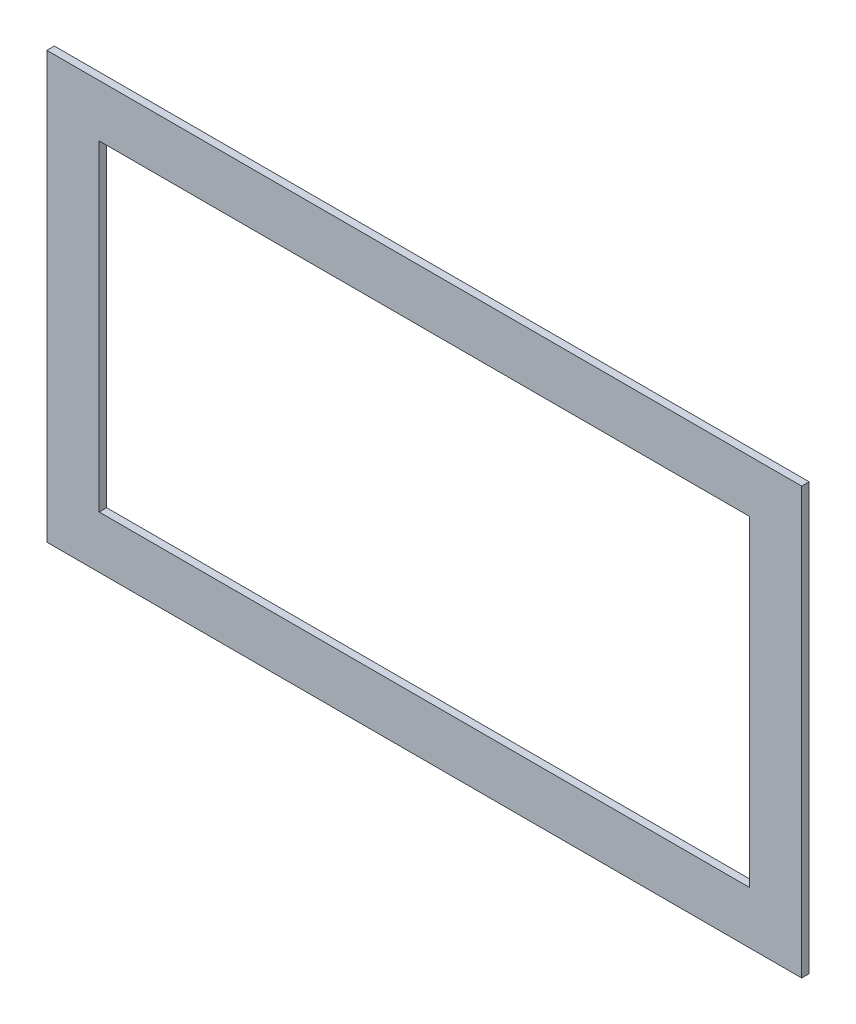
ISO-10303-21;
HEADER;
FILE_DESCRIPTION(('STEP AP214'),'2;1');
FILE_NAME('part.step','',(''),(''),'','','');
FILE_SCHEMA(('AUTOMOTIVE_DESIGN { 1 0 10303 214 1 1 1 1 }'));
ENDSEC;
DATA;
#1=APPLICATION_CONTEXT('core data for automotive mechanical design processes');
#2=APPLICATION_PROTOCOL_DEFINITION('international standard','automotive_design',2000,#1);
#3=PRODUCT_CONTEXT('',#1,'mechanical');
#4=PRODUCT('Part','Part','',(#3));
#5=PRODUCT_RELATED_PRODUCT_CATEGORY('part','',(#4));
#6=PRODUCT_DEFINITION_FORMATION('','',#4);
#7=PRODUCT_DEFINITION_CONTEXT('part definition',#1,'design');
#8=PRODUCT_DEFINITION('design','',#6,#7);
#9=PRODUCT_DEFINITION_SHAPE('','',#8);
#10=(LENGTH_UNIT() NAMED_UNIT(*) SI_UNIT(.MILLI.,.METRE.));
#11=(NAMED_UNIT(*) PLANE_ANGLE_UNIT() SI_UNIT($,.RADIAN.));
#12=(NAMED_UNIT(*) SI_UNIT($,.STERADIAN.) SOLID_ANGLE_UNIT());
#13=UNCERTAINTY_MEASURE_WITH_UNIT(LENGTH_MEASURE(1.E-05),#10,'distance_accuracy_value','');
#14=(GEOMETRIC_REPRESENTATION_CONTEXT(3) GLOBAL_UNCERTAINTY_ASSIGNED_CONTEXT((#13)) GLOBAL_UNIT_ASSIGNED_CONTEXT((#10,
#11,#12)) REPRESENTATION_CONTEXT('',''));
#15=CARTESIAN_POINT('',(0.,0.,0.));
#16=DIRECTION('',(0.,0.,1.));
#17=DIRECTION('',(1.,0.,0.));
#18=AXIS2_PLACEMENT_3D('',#15,#16,#17);
#19=CARTESIAN_POINT('',(0.,0.,1.));
#20=DIRECTION('',(0.,0.,-1.));
#21=DIRECTION('',(-1.,0.,0.));
#22=AXIS2_PLACEMENT_3D('',#19,#20,#21);
#23=PLANE('',#22);
#24=DIRECTION('',(0.,-1.,0.));
#25=VECTOR('',#24,1.);
#26=CARTESIAN_POINT('',(0.,0.,1.));
#27=LINE('',#26,#25);
#28=CARTESIAN_POINT('',(0.,57.,1.));
#29=VERTEX_POINT('',#28);
#30=CARTESIAN_POINT('',(0.,0.,1.));
#31=VERTEX_POINT('',#30);
#32=EDGE_CURVE('E143',#29,#31,#27,.T.);
#33=ORIENTED_EDGE('',*,*,#32,.T.);
#34=DIRECTION('',(1.,0.,0.));
#35=VECTOR('',#34,1.);
#36=CARTESIAN_POINT('',(0.,0.,1.));
#37=LINE('',#36,#35);
#38=CARTESIAN_POINT('',(101.,0.,1.));
#39=VERTEX_POINT('',#38);
#40=EDGE_CURVE('E150',#31,#39,#37,.T.);
#41=ORIENTED_EDGE('',*,*,#40,.T.);
#42=DIRECTION('',(0.,1.,0.));
#43=VECTOR('',#42,1.);
#44=CARTESIAN_POINT('',(101.,0.,1.));
#45=LINE('',#44,#43);
#46=CARTESIAN_POINT('',(101.,57.,1.));
#47=VERTEX_POINT('',#46);
#48=EDGE_CURVE('E148',#39,#47,#45,.T.);
#49=ORIENTED_EDGE('',*,*,#48,.T.);
#50=DIRECTION('',(-1.,0.,0.));
#51=VECTOR('',#50,1.);
#52=CARTESIAN_POINT('',(0.,57.,1.));
#53=LINE('',#52,#51);
#54=EDGE_CURVE('E155',#47,#29,#53,.T.);
#55=ORIENTED_EDGE('',*,*,#54,.T.);
#56=EDGE_LOOP('',(#33,#41,#49,#55));
#57=FACE_BOUND('',#56,.T.);
#58=DIRECTION('',(0.,-1.,0.));
#59=VECTOR('',#58,1.);
#60=CARTESIAN_POINT('',(7.,7.,1.));
#61=LINE('',#60,#59);
#62=CARTESIAN_POINT('',(7.,50.,1.));
#63=VERTEX_POINT('',#62);
#64=CARTESIAN_POINT('',(7.,7.,1.));
#65=VERTEX_POINT('',#64);
#66=EDGE_CURVE('E106',#63,#65,#61,.T.);
#67=ORIENTED_EDGE('',*,*,#66,.F.);
#68=DIRECTION('',(-1.,0.,0.));
#69=VECTOR('',#68,1.);
#70=CARTESIAN_POINT('',(7.,50.,1.));
#71=LINE('',#70,#69);
#72=CARTESIAN_POINT('',(94.,50.,1.));
#73=VERTEX_POINT('',#72);
#74=EDGE_CURVE('E127',#73,#63,#71,.T.);
#75=ORIENTED_EDGE('',*,*,#74,.F.);
#76=DIRECTION('',(0.,1.,0.));
#77=VECTOR('',#76,1.);
#78=CARTESIAN_POINT('',(94.,7.,1.));
#79=LINE('',#78,#77);
#80=CARTESIAN_POINT('',(94.,7.,1.));
#81=VERTEX_POINT('',#80);
#82=EDGE_CURVE('E126',#81,#73,#79,.T.);
#83=ORIENTED_EDGE('',*,*,#82,.F.);
#84=DIRECTION('',(1.,0.,0.));
#85=VECTOR('',#84,1.);
#86=CARTESIAN_POINT('',(7.,7.,1.));
#87=LINE('',#86,#85);
#88=EDGE_CURVE('E116',#65,#81,#87,.T.);
#89=ORIENTED_EDGE('',*,*,#88,.F.);
#90=EDGE_LOOP('',(#67,#75,#83,#89));
#91=FACE_BOUND('',#90,.T.);
#92=ADVANCED_FACE('F43',(#57,#91),#23,.F.);
#93=CARTESIAN_POINT('',(0.,0.,0.));
#94=DIRECTION('',(0.,0.,-1.));
#95=DIRECTION('',(-1.,0.,0.));
#96=AXIS2_PLACEMENT_3D('',#93,#94,#95);
#97=PLANE('',#96);
#98=DIRECTION('',(0.,-1.,0.));
#99=VECTOR('',#98,1.);
#100=CARTESIAN_POINT('',(0.,0.,0.));
#101=LINE('',#100,#99);
#102=CARTESIAN_POINT('',(0.,57.,0.));
#103=VERTEX_POINT('',#102);
#104=CARTESIAN_POINT('',(0.,0.,0.));
#105=VERTEX_POINT('',#104);
#106=EDGE_CURVE('E125',#103,#105,#101,.T.);
#107=ORIENTED_EDGE('',*,*,#106,.F.);
#108=DIRECTION('',(-1.,0.,0.));
#109=VECTOR('',#108,1.);
#110=CARTESIAN_POINT('',(0.,57.,0.));
#111=LINE('',#110,#109);
#112=CARTESIAN_POINT('',(101.,57.,0.));
#113=VERTEX_POINT('',#112);
#114=EDGE_CURVE('E149',#113,#103,#111,.T.);
#115=ORIENTED_EDGE('',*,*,#114,.F.);
#116=DIRECTION('',(0.,1.,0.));
#117=VECTOR('',#116,1.);
#118=CARTESIAN_POINT('',(101.,0.,0.));
#119=LINE('',#118,#117);
#120=CARTESIAN_POINT('',(101.,0.,0.));
#121=VERTEX_POINT('',#120);
#122=EDGE_CURVE('E159',#121,#113,#119,.T.);
#123=ORIENTED_EDGE('',*,*,#122,.F.);
#124=DIRECTION('',(1.,0.,0.));
#125=VECTOR('',#124,1.);
#126=CARTESIAN_POINT('',(0.,0.,0.));
#127=LINE('',#126,#125);
#128=EDGE_CURVE('E160',#105,#121,#127,.T.);
#129=ORIENTED_EDGE('',*,*,#128,.F.);
#130=EDGE_LOOP('',(#107,#115,#123,#129));
#131=FACE_BOUND('',#130,.T.);
#132=DIRECTION('',(-1.,0.,0.));
#133=VECTOR('',#132,1.);
#134=CARTESIAN_POINT('',(7.,50.,0.));
#135=LINE('',#134,#133);
#136=CARTESIAN_POINT('',(94.,50.,0.));
#137=VERTEX_POINT('',#136);
#138=CARTESIAN_POINT('',(7.,50.,0.));
#139=VERTEX_POINT('',#138);
#140=EDGE_CURVE('E117',#137,#139,#135,.T.);
#141=ORIENTED_EDGE('',*,*,#140,.T.);
#142=DIRECTION('',(0.,-1.,0.));
#143=VECTOR('',#142,1.);
#144=CARTESIAN_POINT('',(7.,7.,0.));
#145=LINE('',#144,#143);
#146=CARTESIAN_POINT('',(7.,7.,0.));
#147=VERTEX_POINT('',#146);
#148=EDGE_CURVE('E67',#139,#147,#145,.T.);
#149=ORIENTED_EDGE('',*,*,#148,.T.);
#150=DIRECTION('',(1.,0.,0.));
#151=VECTOR('',#150,1.);
#152=CARTESIAN_POINT('',(7.,7.,0.));
#153=LINE('',#152,#151);
#154=CARTESIAN_POINT('',(94.,7.,0.));
#155=VERTEX_POINT('',#154);
#156=EDGE_CURVE('E121',#147,#155,#153,.T.);
#157=ORIENTED_EDGE('',*,*,#156,.T.);
#158=DIRECTION('',(0.,1.,0.));
#159=VECTOR('',#158,1.);
#160=CARTESIAN_POINT('',(94.,7.,0.));
#161=LINE('',#160,#159);
#162=EDGE_CURVE('E136',#155,#137,#161,.T.);
#163=ORIENTED_EDGE('',*,*,#162,.T.);
#164=EDGE_LOOP('',(#141,#149,#157,#163));
#165=FACE_BOUND('',#164,.T.);
#166=ADVANCED_FACE('F180',(#131,#165),#97,.T.);
#167=CARTESIAN_POINT('',(0.,0.,1.));
#168=DIRECTION('',(1.,0.,0.));
#169=DIRECTION('',(0.,0.,-1.));
#170=AXIS2_PLACEMENT_3D('',#167,#168,#169);
#171=PLANE('',#170);
#172=ORIENTED_EDGE('',*,*,#106,.T.);
#173=DIRECTION('',(0.,0.,-1.));
#174=VECTOR('',#173,1.);
#175=CARTESIAN_POINT('',(0.,0.,1.));
#176=LINE('',#175,#174);
#177=EDGE_CURVE('E11',#31,#105,#176,.T.);
#178=ORIENTED_EDGE('',*,*,#177,.F.);
#179=ORIENTED_EDGE('',*,*,#32,.F.);
#180=DIRECTION('',(0.,0.,-1.));
#181=VECTOR('',#180,1.);
#182=CARTESIAN_POINT('',(0.,57.,1.));
#183=LINE('',#182,#181);
#184=EDGE_CURVE('E154',#29,#103,#183,.T.);
#185=ORIENTED_EDGE('',*,*,#184,.T.);
#186=EDGE_LOOP('',(#172,#178,#179,#185));
#187=FACE_BOUND('',#186,.T.);
#188=ADVANCED_FACE('F44',(#187),#171,.F.);
#189=CARTESIAN_POINT('',(0.,0.,1.));
#190=DIRECTION('',(0.,1.,0.));
#191=DIRECTION('',(0.,0.,1.));
#192=AXIS2_PLACEMENT_3D('',#189,#190,#191);
#193=PLANE('',#192);
#194=ORIENTED_EDGE('',*,*,#128,.T.);
#195=DIRECTION('',(0.,0.,-1.));
#196=VECTOR('',#195,1.);
#197=CARTESIAN_POINT('',(101.,0.,1.));
#198=LINE('',#197,#196);
#199=EDGE_CURVE('E51',#39,#121,#198,.T.);
#200=ORIENTED_EDGE('',*,*,#199,.F.);
#201=ORIENTED_EDGE('',*,*,#40,.F.);
#202=ORIENTED_EDGE('',*,*,#177,.T.);
#203=EDGE_LOOP('',(#194,#200,#201,#202));
#204=FACE_BOUND('',#203,.T.);
#205=ADVANCED_FACE('F190',(#204),#193,.F.);
#206=CARTESIAN_POINT('',(101.,0.,1.));
#207=DIRECTION('',(-1.,0.,0.));
#208=DIRECTION('',(0.,0.,1.));
#209=AXIS2_PLACEMENT_3D('',#206,#207,#208);
#210=PLANE('',#209);
#211=ORIENTED_EDGE('',*,*,#122,.T.);
#212=DIRECTION('',(0.,0.,-1.));
#213=VECTOR('',#212,1.);
#214=CARTESIAN_POINT('',(101.,57.,1.));
#215=LINE('',#214,#213);
#216=EDGE_CURVE('E163',#47,#113,#215,.T.);
#217=ORIENTED_EDGE('',*,*,#216,.F.);
#218=ORIENTED_EDGE('',*,*,#48,.F.);
#219=ORIENTED_EDGE('',*,*,#199,.T.);
#220=EDGE_LOOP('',(#211,#217,#218,#219));
#221=FACE_BOUND('',#220,.T.);
#222=ADVANCED_FACE('F173',(#221),#210,.F.);
#223=CARTESIAN_POINT('',(0.,57.,1.));
#224=DIRECTION('',(0.,-1.,0.));
#225=DIRECTION('',(0.,0.,-1.));
#226=AXIS2_PLACEMENT_3D('',#223,#224,#225);
#227=PLANE('',#226);
#228=ORIENTED_EDGE('',*,*,#114,.T.);
#229=ORIENTED_EDGE('',*,*,#184,.F.);
#230=ORIENTED_EDGE('',*,*,#54,.F.);
#231=ORIENTED_EDGE('',*,*,#216,.T.);
#232=EDGE_LOOP('',(#228,#229,#230,#231));
#233=FACE_BOUND('',#232,.T.);
#234=ADVANCED_FACE('F181',(#233),#227,.F.);
#235=CARTESIAN_POINT('',(7.,7.,1.));
#236=DIRECTION('',(1.,0.,0.));
#237=DIRECTION('',(0.,0.,-1.));
#238=AXIS2_PLACEMENT_3D('',#235,#236,#237);
#239=PLANE('',#238);
#240=ORIENTED_EDGE('',*,*,#148,.F.);
#241=DIRECTION('',(0.,0.,-1.));
#242=VECTOR('',#241,1.);
#243=CARTESIAN_POINT('',(7.,50.,1.));
#244=LINE('',#243,#242);
#245=EDGE_CURVE('E115',#63,#139,#244,.T.);
#246=ORIENTED_EDGE('',*,*,#245,.F.);
#247=ORIENTED_EDGE('',*,*,#66,.T.);
#248=DIRECTION('',(0.,0.,-1.));
#249=VECTOR('',#248,1.);
#250=CARTESIAN_POINT('',(7.,7.,1.));
#251=LINE('',#250,#249);
#252=EDGE_CURVE('E112',#65,#147,#251,.T.);
#253=ORIENTED_EDGE('',*,*,#252,.T.);
#254=EDGE_LOOP('',(#240,#246,#247,#253));
#255=FACE_BOUND('',#254,.T.);
#256=ADVANCED_FACE('F107',(#255),#239,.T.);
#257=CARTESIAN_POINT('',(7.,7.,1.));
#258=DIRECTION('',(0.,1.,0.));
#259=DIRECTION('',(0.,0.,1.));
#260=AXIS2_PLACEMENT_3D('',#257,#258,#259);
#261=PLANE('',#260);
#262=ORIENTED_EDGE('',*,*,#156,.F.);
#263=ORIENTED_EDGE('',*,*,#252,.F.);
#264=ORIENTED_EDGE('',*,*,#88,.T.);
#265=DIRECTION('',(0.,0.,-1.));
#266=VECTOR('',#265,1.);
#267=CARTESIAN_POINT('',(94.,7.,1.));
#268=LINE('',#267,#266);
#269=EDGE_CURVE('E124',#81,#155,#268,.T.);
#270=ORIENTED_EDGE('',*,*,#269,.T.);
#271=EDGE_LOOP('',(#262,#263,#264,#270));
#272=FACE_BOUND('',#271,.T.);
#273=ADVANCED_FACE('F120',(#272),#261,.T.);
#274=CARTESIAN_POINT('',(94.,7.,1.));
#275=DIRECTION('',(-1.,0.,0.));
#276=DIRECTION('',(0.,0.,1.));
#277=AXIS2_PLACEMENT_3D('',#274,#275,#276);
#278=PLANE('',#277);
#279=ORIENTED_EDGE('',*,*,#162,.F.);
#280=ORIENTED_EDGE('',*,*,#269,.F.);
#281=ORIENTED_EDGE('',*,*,#82,.T.);
#282=DIRECTION('',(0.,0.,-1.));
#283=VECTOR('',#282,1.);
#284=CARTESIAN_POINT('',(94.,50.,1.));
#285=LINE('',#284,#283);
#286=EDGE_CURVE('E59',#73,#137,#285,.T.);
#287=ORIENTED_EDGE('',*,*,#286,.T.);
#288=EDGE_LOOP('',(#279,#280,#281,#287));
#289=FACE_BOUND('',#288,.T.);
#290=ADVANCED_FACE('F210',(#289),#278,.T.);
#291=CARTESIAN_POINT('',(7.,50.,1.));
#292=DIRECTION('',(0.,-1.,0.));
#293=DIRECTION('',(0.,0.,-1.));
#294=AXIS2_PLACEMENT_3D('',#291,#292,#293);
#295=PLANE('',#294);
#296=ORIENTED_EDGE('',*,*,#140,.F.);
#297=ORIENTED_EDGE('',*,*,#286,.F.);
#298=ORIENTED_EDGE('',*,*,#74,.T.);
#299=ORIENTED_EDGE('',*,*,#245,.T.);
#300=EDGE_LOOP('',(#296,#297,#298,#299));
#301=FACE_BOUND('',#300,.T.);
#302=ADVANCED_FACE('F215',(#301),#295,.T.);
#303=CLOSED_SHELL('',(#92,#166,#188,#205,#222,#234,#256,#273,#290,#302));
#304=MANIFOLD_SOLID_BREP('B2',#303);
#305=ADVANCED_BREP_SHAPE_REPRESENTATION('',(#18,#304),#14);
#306=SHAPE_DEFINITION_REPRESENTATION(#9,#305);
ENDSEC;
END-ISO-10303-21;
